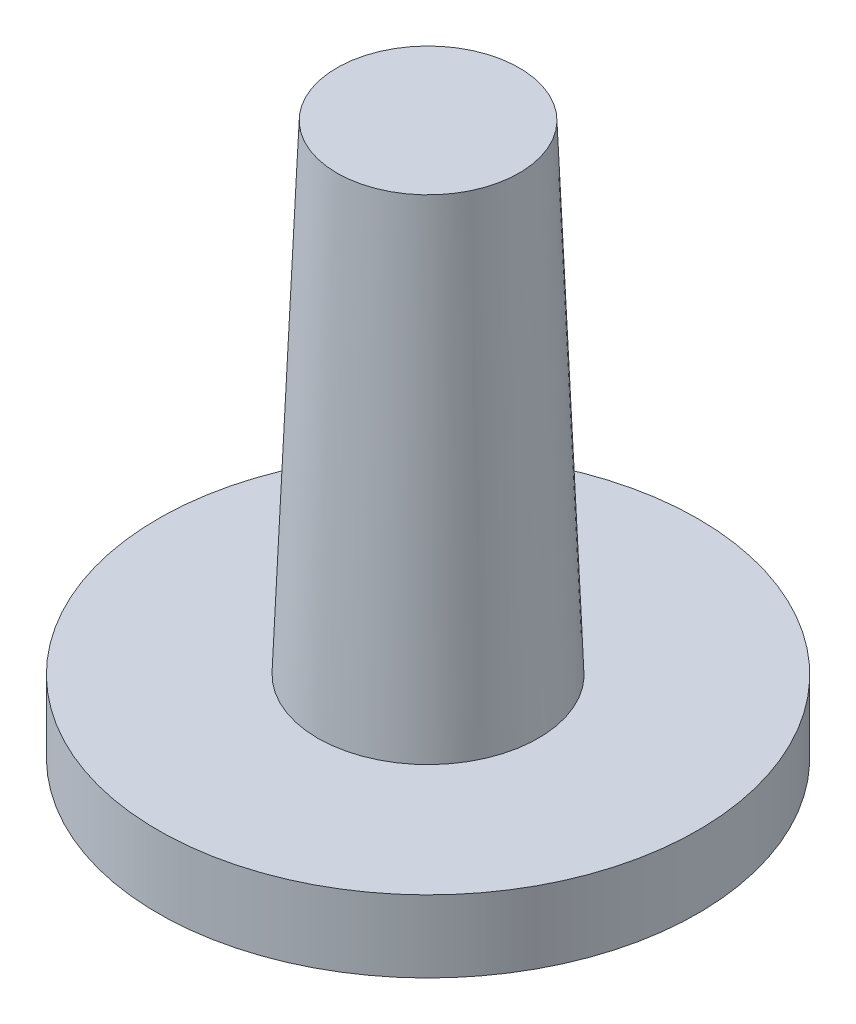
ISO-10303-21;
HEADER;
FILE_DESCRIPTION(('STEP AP214'),'2;1');
FILE_NAME('part.step','',(''),(''),'','','');
FILE_SCHEMA(('AUTOMOTIVE_DESIGN { 1 0 10303 214 1 1 1 1 }'));
ENDSEC;
DATA;
#1=APPLICATION_CONTEXT('core data for automotive mechanical design processes');
#2=APPLICATION_PROTOCOL_DEFINITION('international standard','automotive_design',2000,#1);
#3=PRODUCT_CONTEXT('',#1,'mechanical');
#4=PRODUCT('Part','Part','',(#3));
#5=PRODUCT_RELATED_PRODUCT_CATEGORY('part','',(#4));
#6=PRODUCT_DEFINITION_FORMATION('','',#4);
#7=PRODUCT_DEFINITION_CONTEXT('part definition',#1,'design');
#8=PRODUCT_DEFINITION('design','',#6,#7);
#9=PRODUCT_DEFINITION_SHAPE('','',#8);
#10=(LENGTH_UNIT() NAMED_UNIT(*) SI_UNIT(.MILLI.,.METRE.));
#11=(NAMED_UNIT(*) PLANE_ANGLE_UNIT() SI_UNIT($,.RADIAN.));
#12=(NAMED_UNIT(*) SI_UNIT($,.STERADIAN.) SOLID_ANGLE_UNIT());
#13=UNCERTAINTY_MEASURE_WITH_UNIT(LENGTH_MEASURE(1.E-05),#10,'distance_accuracy_value','');
#14=(GEOMETRIC_REPRESENTATION_CONTEXT(3) GLOBAL_UNCERTAINTY_ASSIGNED_CONTEXT((#13)) GLOBAL_UNIT_ASSIGNED_CONTEXT((#10,
#11,#12)) REPRESENTATION_CONTEXT('',''));
#15=CARTESIAN_POINT('',(0.,0.,0.));
#16=DIRECTION('',(0.,0.,1.));
#17=DIRECTION('',(1.,0.,0.));
#18=AXIS2_PLACEMENT_3D('',#15,#16,#17);
#19=CARTESIAN_POINT('',(0.,0.9525,0.));
#20=DIRECTION('',(0.,-1.,0.));
#21=DIRECTION('',(0.,0.,-1.));
#22=AXIS2_PLACEMENT_3D('',#19,#20,#21);
#23=CYLINDRICAL_SURFACE('',#22,3.571875);
#24=CARTESIAN_POINT('',(0.,0.9525,0.));
#25=DIRECTION('',(0.,1.,0.));
#26=DIRECTION('',(0.,0.,1.));
#27=AXIS2_PLACEMENT_3D('',#24,#25,#26);
#28=CIRCLE('',#27,3.571875);
#29=CARTESIAN_POINT('',(0.,0.9525,-3.571875));
#30=VERTEX_POINT('',#29);
#31=EDGE_CURVE('E10',#30,#30,#28,.T.);
#32=CARTESIAN_POINT('',(0.,0.,0.));
#33=DIRECTION('',(0.,1.,0.));
#34=DIRECTION('',(0.,0.,1.));
#35=AXIS2_PLACEMENT_3D('',#32,#33,#34);
#36=CIRCLE('',#35,3.571875);
#37=CARTESIAN_POINT('',(0.,0.,-3.571875));
#38=VERTEX_POINT('',#37);
#39=EDGE_CURVE('E33',#38,#38,#36,.T.);
#40=CARTESIAN_POINT('',(0.,0.9525,-3.571875));
#41=CARTESIAN_POINT('',(0.,0.942578125,-3.571875));
#42=CARTESIAN_POINT('',(0.,0.93265625,-3.571875));
#43=CARTESIAN_POINT('',(0.,0.9128125,-3.571875));
#44=CARTESIAN_POINT('',(0.,0.902890625,-3.571875));
#45=CARTESIAN_POINT('',(0.,0.883046875,-3.571875));
#46=CARTESIAN_POINT('',(0.,0.873125,-3.571875));
#47=CARTESIAN_POINT('',(0.,0.85328125,-3.571875));
#48=CARTESIAN_POINT('',(0.,0.843359375,-3.571875));
#49=CARTESIAN_POINT('',(0.,0.823515625,-3.571875));
#50=CARTESIAN_POINT('',(0.,0.81359375,-3.571875));
#51=CARTESIAN_POINT('',(0.,0.79375,-3.571875));
#52=CARTESIAN_POINT('',(0.,0.783828125,-3.571875));
#53=CARTESIAN_POINT('',(0.,0.763984375,-3.571875));
#54=CARTESIAN_POINT('',(0.,0.7540625,-3.571875));
#55=CARTESIAN_POINT('',(0.,0.73421875,-3.571875));
#56=CARTESIAN_POINT('',(0.,0.724296875,-3.571875));
#57=CARTESIAN_POINT('',(0.,0.704453125,-3.571875));
#58=CARTESIAN_POINT('',(0.,0.69453125,-3.571875));
#59=CARTESIAN_POINT('',(0.,0.6746875,-3.571875));
#60=CARTESIAN_POINT('',(0.,0.664765625,-3.571875));
#61=CARTESIAN_POINT('',(0.,0.644921875,-3.571875));
#62=CARTESIAN_POINT('',(0.,0.635,-3.571875));
#63=CARTESIAN_POINT('',(0.,0.61515625,-3.571875));
#64=CARTESIAN_POINT('',(0.,0.605234375,-3.571875));
#65=CARTESIAN_POINT('',(0.,0.585390625,-3.571875));
#66=CARTESIAN_POINT('',(0.,0.57546875,-3.571875));
#67=CARTESIAN_POINT('',(0.,0.555625,-3.571875));
#68=CARTESIAN_POINT('',(0.,0.545703125,-3.571875));
#69=CARTESIAN_POINT('',(0.,0.525859375,-3.571875));
#70=CARTESIAN_POINT('',(0.,0.5159375,-3.571875));
#71=CARTESIAN_POINT('',(0.,0.49609375,-3.571875));
#72=CARTESIAN_POINT('',(0.,0.486171875,-3.571875));
#73=CARTESIAN_POINT('',(0.,0.466328125,-3.571875));
#74=CARTESIAN_POINT('',(0.,0.45640625,-3.571875));
#75=CARTESIAN_POINT('',(0.,0.4365625,-3.571875));
#76=CARTESIAN_POINT('',(0.,0.426640625,-3.571875));
#77=CARTESIAN_POINT('',(0.,0.406796875,-3.571875));
#78=CARTESIAN_POINT('',(0.,0.396875,-3.571875));
#79=CARTESIAN_POINT('',(0.,0.37703125,-3.571875));
#80=CARTESIAN_POINT('',(0.,0.367109375,-3.571875));
#81=CARTESIAN_POINT('',(0.,0.347265625,-3.571875));
#82=CARTESIAN_POINT('',(0.,0.33734375,-3.571875));
#83=CARTESIAN_POINT('',(0.,0.3175,-3.571875));
#84=CARTESIAN_POINT('',(0.,0.307578125,-3.571875));
#85=CARTESIAN_POINT('',(0.,0.287734375,-3.571875));
#86=CARTESIAN_POINT('',(0.,0.2778125,-3.571875));
#87=CARTESIAN_POINT('',(0.,0.25796875,-3.571875));
#88=CARTESIAN_POINT('',(0.,0.248046875,-3.571875));
#89=CARTESIAN_POINT('',(0.,0.228203125,-3.571875));
#90=CARTESIAN_POINT('',(0.,0.21828125,-3.571875));
#91=CARTESIAN_POINT('',(0.,0.1984375,-3.571875));
#92=CARTESIAN_POINT('',(0.,0.188515625,-3.571875));
#93=CARTESIAN_POINT('',(0.,0.168671875,-3.571875));
#94=CARTESIAN_POINT('',(0.,0.15875,-3.571875));
#95=CARTESIAN_POINT('',(0.,0.13890625,-3.571875));
#96=CARTESIAN_POINT('',(0.,0.128984375,-3.571875));
#97=CARTESIAN_POINT('',(0.,0.109140625,-3.571875));
#98=CARTESIAN_POINT('',(0.,0.09921875,-3.571875));
#99=CARTESIAN_POINT('',(0.,0.079375,-3.571875));
#100=CARTESIAN_POINT('',(0.,0.069453125,-3.571875));
#101=CARTESIAN_POINT('',(0.,0.049609375,-3.571875));
#102=CARTESIAN_POINT('',(0.,0.0396875,-3.571875));
#103=CARTESIAN_POINT('',(0.,0.01984375,-3.571875));
#104=CARTESIAN_POINT('',(0.,0.00992187499999998,-3.571875));
#105=CARTESIAN_POINT('',(0.,0.,-3.571875));
#106=B_SPLINE_CURVE_WITH_KNOTS('',3,(#40,#41,#42,#43,#44,#45,#46,#47,#48,#49,#50,#51,#52,#53,
#54,#55,#56,#57,#58,#59,#60,#61,#62,#63,#64,#65,#66,#67,#68,#69,#70,#71,#72,#73,#74,#75,#76,#77,
#78,#79,#80,#81,#82,#83,#84,#85,#86,#87,#88,#89,#90,#91,#92,#93,#94,#95,#96,#97,#98,#99,#100,
#101,#102,#103,#104,#105),.UNSPECIFIED.,.F.,.F.,(4,2,2,2,2,2,2,2,2,2,2,2,2,2,2,2,2,2,2,2,2,2,2,
2,2,2,2,2,2,2,2,2,4),(0.,0.0297656250000001,0.05953125,0.0892968750000001,0.1190625,0.148828125,
0.17859375,0.208359375,0.238125,0.267890625,0.29765625,0.327421875,0.3571875,0.386953125,
0.41671875,0.446484375,0.47625,0.506015625,0.53578125,0.565546875,0.5953125,0.625078125,
0.65484375,0.684609375,0.714375,0.744140625,0.77390625,0.803671875,0.8334375,0.863203125,
0.89296875,0.922734375,0.9525),.UNSPECIFIED.);
#107=EDGE_CURVE('BSEAM30',#30,#38,#106,.T.);
#108=ORIENTED_EDGE('',*,*,#31,.F.);
#109=ORIENTED_EDGE('',*,*,#39,.T.);
#110=ORIENTED_EDGE('',*,*,#107,.T.);
#111=ORIENTED_EDGE('',*,*,#107,.F.);
#112=EDGE_LOOP('',(#108,#110,#109,#111));
#113=FACE_BOUND('',#112,.T.);
#114=ADVANCED_FACE('F30',(#113),#23,.T.);
#115=CARTESIAN_POINT('',(0.,0.9525,0.));
#116=DIRECTION('',(0.,1.,0.));
#117=DIRECTION('',(0.,0.,1.));
#118=AXIS2_PLACEMENT_3D('',#115,#116,#117);
#119=PLANE('',#118);
#120=CARTESIAN_POINT('',(0.,0.9525,0.));
#121=DIRECTION('',(0.,1.,0.));
#122=DIRECTION('',(0.,0.,1.));
#123=AXIS2_PLACEMENT_3D('',#120,#121,#122);
#124=CIRCLE('',#123,1.4605);
#125=CARTESIAN_POINT('',(0.,0.9525,1.4605));
#126=VERTEX_POINT('',#125);
#127=EDGE_CURVE('E44',#126,#126,#124,.T.);
#128=ORIENTED_EDGE('',*,*,#127,.F.);
#129=EDGE_LOOP('',(#128));
#130=FACE_BOUND('',#129,.T.);
#131=ORIENTED_EDGE('',*,*,#31,.T.);
#132=EDGE_LOOP('',(#131));
#133=FACE_BOUND('',#132,.T.);
#134=ADVANCED_FACE('F50',(#130,#133),#119,.T.);
#135=CARTESIAN_POINT('',(0.,0.,0.));
#136=DIRECTION('',(0.,1.,0.));
#137=DIRECTION('',(0.,0.,1.));
#138=AXIS2_PLACEMENT_3D('',#135,#136,#137);
#139=PLANE('',#138);
#140=ORIENTED_EDGE('',*,*,#39,.F.);
#141=EDGE_LOOP('',(#140));
#142=FACE_BOUND('',#141,.T.);
#143=ADVANCED_FACE('F52',(#142),#139,.F.);
#144=CARTESIAN_POINT('',(0.,0.9525,0.));
#145=DIRECTION('',(0.,-1.,0.));
#146=DIRECTION('',(0.,0.,-1.));
#147=AXIS2_PLACEMENT_3D('',#144,#145,#146);
#148=CONICAL_SURFACE('',#147,1.4605,0.03997868712329);
#149=CARTESIAN_POINT('',(0.,7.3025,0.));
#150=DIRECTION('',(0.,1.,0.));
#151=DIRECTION('',(0.,0.,1.));
#152=AXIS2_PLACEMENT_3D('',#149,#150,#151);
#153=CIRCLE('',#152,1.2065);
#154=CARTESIAN_POINT('',(0.,7.3025,1.2065));
#155=VERTEX_POINT('',#154);
#156=EDGE_CURVE('E40',#155,#155,#153,.T.);
#157=ORIENTED_EDGE('',*,*,#156,.F.);
#158=EDGE_LOOP('',(#157));
#159=FACE_BOUND('',#158,.T.);
#160=ORIENTED_EDGE('',*,*,#127,.T.);
#161=EDGE_LOOP('',(#160));
#162=FACE_BOUND('',#161,.T.);
#163=ADVANCED_FACE('F48',(#159,#162),#148,.T.);
#164=CARTESIAN_POINT('',(0.,7.3025,0.));
#165=DIRECTION('',(0.,1.,0.));
#166=DIRECTION('',(0.,0.,1.));
#167=AXIS2_PLACEMENT_3D('',#164,#165,#166);
#168=PLANE('',#167);
#169=ORIENTED_EDGE('',*,*,#156,.T.);
#170=EDGE_LOOP('',(#169));
#171=FACE_BOUND('',#170,.T.);
#172=ADVANCED_FACE('F61',(#171),#168,.T.);
#173=CLOSED_SHELL('',(#114,#134,#143,#163,#172));
#174=MANIFOLD_SOLID_BREP('B2',#173);
#175=ADVANCED_BREP_SHAPE_REPRESENTATION('',(#18,#174),#14);
#176=SHAPE_DEFINITION_REPRESENTATION(#9,#175);
ENDSEC;
END-ISO-10303-21;
